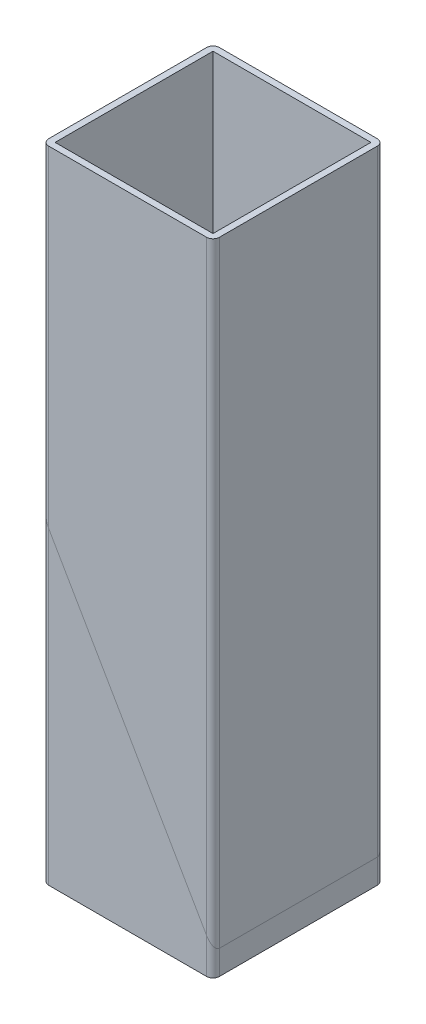
ISO-10303-21;
HEADER;
FILE_DESCRIPTION(('STEP AP214'),'2;1');
FILE_NAME('part.step','',(''),(''),'','','');
FILE_SCHEMA(('AUTOMOTIVE_DESIGN { 1 0 10303 214 1 1 1 1 }'));
ENDSEC;
DATA;
#1=APPLICATION_CONTEXT('core data for automotive mechanical design processes');
#2=APPLICATION_PROTOCOL_DEFINITION('international standard','automotive_design',2000,#1);
#3=PRODUCT_CONTEXT('',#1,'mechanical');
#4=PRODUCT('Part','Part','',(#3));
#5=PRODUCT_RELATED_PRODUCT_CATEGORY('part','',(#4));
#6=PRODUCT_DEFINITION_FORMATION('','',#4);
#7=PRODUCT_DEFINITION_CONTEXT('part definition',#1,'design');
#8=PRODUCT_DEFINITION('design','',#6,#7);
#9=PRODUCT_DEFINITION_SHAPE('','',#8);
#10=(LENGTH_UNIT() NAMED_UNIT(*) SI_UNIT(.MILLI.,.METRE.));
#11=(NAMED_UNIT(*) PLANE_ANGLE_UNIT() SI_UNIT($,.RADIAN.));
#12=(NAMED_UNIT(*) SI_UNIT($,.STERADIAN.) SOLID_ANGLE_UNIT());
#13=UNCERTAINTY_MEASURE_WITH_UNIT(LENGTH_MEASURE(1.E-05),#10,'distance_accuracy_value','');
#14=(GEOMETRIC_REPRESENTATION_CONTEXT(3) GLOBAL_UNCERTAINTY_ASSIGNED_CONTEXT((#13)) GLOBAL_UNIT_ASSIGNED_CONTEXT((#10,
#11,#12)) REPRESENTATION_CONTEXT('',''));
#15=CARTESIAN_POINT('',(0.,0.,0.));
#16=DIRECTION('',(0.,0.,1.));
#17=DIRECTION('',(1.,0.,0.));
#18=AXIS2_PLACEMENT_3D('',#15,#16,#17);
#19=CARTESIAN_POINT('',(-40.,150.,-40.01));
#20=DIRECTION('',(-0.866025403784442,-0.499999999999995,0.));
#21=DIRECTION('',(0.499999999999995,-0.866025403784442,0.));
#22=AXIS2_PLACEMENT_3D('',#19,#20,#21);
#23=PLANE('',#22);
#24=CARTESIAN_POINT('',(-37.,144.803847577293,37.));
#25=DIRECTION('',(-0.866025403784442,-0.499999999999995,0.));
#26=DIRECTION('',(0.499999999999995,-0.866025403784442,0.));
#27=AXIS2_PLACEMENT_3D('',#24,#25,#26);
#28=ELLIPSE('',#27,6.00000000000006,3.);
#29=CARTESIAN_POINT('',(-40.,150.,37.));
#30=VERTEX_POINT('',#29);
#31=CARTESIAN_POINT('',(-37.,144.803847577293,40.));
#32=VERTEX_POINT('',#31);
#33=EDGE_CURVE('E181',#30,#32,#28,.F.);
#34=ORIENTED_EDGE('',*,*,#33,.F.);
#35=DIRECTION('',(0.,0.,-1.));
#36=VECTOR('',#35,1.);
#37=CARTESIAN_POINT('',(-40.,150.,-40.0000000000001));
#38=LINE('',#37,#36);
#39=CARTESIAN_POINT('',(-40.,150.,-37.));
#40=VERTEX_POINT('',#39);
#41=EDGE_CURVE('E190',#30,#40,#38,.T.);
#42=ORIENTED_EDGE('',*,*,#41,.T.);
#43=CARTESIAN_POINT('',(-37.,144.803847577293,-37.));
#44=DIRECTION('',(-0.866025403784442,-0.499999999999995,0.));
#45=DIRECTION('',(0.499999999999995,-0.866025403784442,0.));
#46=AXIS2_PLACEMENT_3D('',#43,#44,#45);
#47=ELLIPSE('',#46,6.00000000000006,3.);
#48=CARTESIAN_POINT('',(-37.,144.803847577293,-40.));
#49=VERTEX_POINT('',#48);
#50=EDGE_CURVE('E179',#49,#40,#47,.F.);
#51=ORIENTED_EDGE('',*,*,#50,.F.);
#52=DIRECTION('',(0.499999999999995,-0.866025403784442,0.));
#53=VECTOR('',#52,1.);
#54=CARTESIAN_POINT('',(-104.951905283832,262.500000000001,-40.));
#55=LINE('',#54,#53);
#56=CARTESIAN_POINT('',(37.,16.6320878171947,-40.));
#57=VERTEX_POINT('',#56);
#58=EDGE_CURVE('E187',#49,#57,#55,.T.);
#59=ORIENTED_EDGE('',*,*,#58,.T.);
#60=CARTESIAN_POINT('',(37.,16.6320878171947,-37.));
#61=DIRECTION('',(-0.866025403784442,-0.499999999999995,0.));
#62=DIRECTION('',(0.499999999999995,-0.866025403784442,0.));
#63=AXIS2_PLACEMENT_3D('',#60,#61,#62);
#64=ELLIPSE('',#63,6.00000000000006,3.);
#65=CARTESIAN_POINT('',(40.,11.435935394488,-37.));
#66=VERTEX_POINT('',#65);
#67=EDGE_CURVE('E174',#66,#57,#64,.F.);
#68=ORIENTED_EDGE('',*,*,#67,.F.);
#69=DIRECTION('',(0.,0.,1.));
#70=VECTOR('',#69,1.);
#71=CARTESIAN_POINT('',(40.,11.435935394488,-40.0000000000001));
#72=LINE('',#71,#70);
#73=CARTESIAN_POINT('',(40.,11.435935394488,37.));
#74=VERTEX_POINT('',#73);
#75=EDGE_CURVE('E149',#66,#74,#72,.T.);
#76=ORIENTED_EDGE('',*,*,#75,.T.);
#77=CARTESIAN_POINT('',(37.,16.6320878171947,37.));
#78=DIRECTION('',(-0.866025403784442,-0.499999999999995,0.));
#79=DIRECTION('',(0.499999999999995,-0.866025403784442,0.));
#80=AXIS2_PLACEMENT_3D('',#77,#78,#79);
#81=ELLIPSE('',#80,6.00000000000006,3.);
#82=CARTESIAN_POINT('',(37.,16.6320878171947,40.));
#83=VERTEX_POINT('',#82);
#84=EDGE_CURVE('E177',#83,#74,#81,.F.);
#85=ORIENTED_EDGE('',*,*,#84,.F.);
#86=DIRECTION('',(-0.499999999999995,0.866025403784442,0.));
#87=VECTOR('',#86,1.);
#88=CARTESIAN_POINT('',(-104.951905283832,262.500000000001,40.));
#89=LINE('',#88,#87);
#90=EDGE_CURVE('E193',#83,#32,#89,.T.);
#91=ORIENTED_EDGE('',*,*,#90,.T.);
#92=EDGE_LOOP('',(#34,#42,#51,#59,#68,#76,#85,#91));
#93=FACE_BOUND('',#92,.T.);
#94=DIRECTION('',(0.,0.,1.));
#95=VECTOR('',#94,1.);
#96=CARTESIAN_POINT('',(37.,16.6320878171947,-37.0000000000002));
#97=LINE('',#96,#95);
#98=CARTESIAN_POINT('',(37.,16.6320878171946,-37.));
#99=VERTEX_POINT('',#98);
#100=CARTESIAN_POINT('',(37.,16.6320878171946,37.));
#101=VERTEX_POINT('',#100);
#102=EDGE_CURVE('E144',#99,#101,#97,.T.);
#103=ORIENTED_EDGE('',*,*,#102,.F.);
#104=DIRECTION('',(0.499999999999995,-0.866025403784442,0.));
#105=VECTOR('',#104,1.);
#106=CARTESIAN_POINT('',(-104.201905283832,261.200961894324,-37.));
#107=LINE('',#106,#105);
#108=CARTESIAN_POINT('',(-37.,144.803847577293,-37.));
#109=VERTEX_POINT('',#108);
#110=EDGE_CURVE('E136',#109,#99,#107,.T.);
#111=ORIENTED_EDGE('',*,*,#110,.F.);
#112=DIRECTION('',(0.,0.,-1.));
#113=VECTOR('',#112,1.);
#114=CARTESIAN_POINT('',(-37.,144.803847577293,-37.0000000000001));
#115=LINE('',#114,#113);
#116=CARTESIAN_POINT('',(-37.,144.803847577293,37.));
#117=VERTEX_POINT('',#116);
#118=EDGE_CURVE('E143',#117,#109,#115,.T.);
#119=ORIENTED_EDGE('',*,*,#118,.F.);
#120=DIRECTION('',(-0.499999999999995,0.866025403784442,0.));
#121=VECTOR('',#120,1.);
#122=CARTESIAN_POINT('',(-104.201905283832,261.200961894324,37.));
#123=LINE('',#122,#121);
#124=EDGE_CURVE('E147',#101,#117,#123,.T.);
#125=ORIENTED_EDGE('',*,*,#124,.F.);
#126=EDGE_LOOP('',(#103,#111,#119,#125));
#127=FACE_BOUND('',#126,.T.);
#128=ADVANCED_FACE('F47',(#93,#127),#23,.T.);
#129=CARTESIAN_POINT('',(-37.,300.,-37.));
#130=DIRECTION('',(0.,0.,1.));
#131=DIRECTION('',(1.,0.,0.));
#132=AXIS2_PLACEMENT_3D('',#129,#130,#131);
#133=PLANE('',#132);
#134=DIRECTION('',(0.,-1.,0.));
#135=VECTOR('',#134,1.);
#136=CARTESIAN_POINT('',(-37.,300.,-37.));
#137=LINE('',#136,#135);
#138=CARTESIAN_POINT('',(-37.,300.,-37.));
#139=VERTEX_POINT('',#138);
#140=EDGE_CURVE('E140',#139,#109,#137,.T.);
#141=ORIENTED_EDGE('',*,*,#140,.T.);
#142=ORIENTED_EDGE('',*,*,#110,.T.);
#143=DIRECTION('',(0.,-1.,0.));
#144=VECTOR('',#143,1.);
#145=CARTESIAN_POINT('',(37.,300.,-37.));
#146=LINE('',#145,#144);
#147=CARTESIAN_POINT('',(37.,300.,-37.));
#148=VERTEX_POINT('',#147);
#149=EDGE_CURVE('E139',#148,#99,#146,.T.);
#150=ORIENTED_EDGE('',*,*,#149,.F.);
#151=DIRECTION('',(-1.,0.,0.));
#152=VECTOR('',#151,1.);
#153=CARTESIAN_POINT('',(-37.,300.,-37.));
#154=LINE('',#153,#152);
#155=EDGE_CURVE('E56',#148,#139,#154,.T.);
#156=ORIENTED_EDGE('',*,*,#155,.T.);
#157=EDGE_LOOP('',(#141,#142,#150,#156));
#158=FACE_BOUND('',#157,.T.);
#159=ADVANCED_FACE('F138',(#158),#133,.T.);
#160=CARTESIAN_POINT('',(-40.,300.,-40.));
#161=DIRECTION('',(1.,0.,0.));
#162=DIRECTION('',(0.,0.,-1.));
#163=AXIS2_PLACEMENT_3D('',#160,#161,#162);
#164=PLANE('',#163);
#165=ORIENTED_EDGE('',*,*,#41,.F.);
#166=DIRECTION('',(0.,-1.,0.));
#167=VECTOR('',#166,1.);
#168=CARTESIAN_POINT('',(-40.,300.,37.));
#169=LINE('',#168,#167);
#170=CARTESIAN_POINT('',(-40.,300.,37.));
#171=VERTEX_POINT('',#170);
#172=EDGE_CURVE('E206',#30,#171,#169,.F.);
#173=ORIENTED_EDGE('',*,*,#172,.T.);
#174=DIRECTION('',(0.,0.,1.));
#175=VECTOR('',#174,1.);
#176=CARTESIAN_POINT('',(-40.,300.,-40.));
#177=LINE('',#176,#175);
#178=CARTESIAN_POINT('',(-40.,300.,-37.));
#179=VERTEX_POINT('',#178);
#180=EDGE_CURVE('E220',#179,#171,#177,.T.);
#181=ORIENTED_EDGE('',*,*,#180,.F.);
#182=DIRECTION('',(0.,-1.,0.));
#183=VECTOR('',#182,1.);
#184=CARTESIAN_POINT('',(-40.,300.,-37.));
#185=LINE('',#184,#183);
#186=EDGE_CURVE('E208',#179,#40,#185,.T.);
#187=ORIENTED_EDGE('',*,*,#186,.T.);
#188=EDGE_LOOP('',(#165,#173,#181,#187));
#189=FACE_BOUND('',#188,.T.);
#190=ADVANCED_FACE('F264',(#189),#164,.F.);
#191=CARTESIAN_POINT('',(0.,300.,0.));
#192=DIRECTION('',(0.,1.,0.));
#193=DIRECTION('',(0.,0.,1.));
#194=AXIS2_PLACEMENT_3D('',#191,#192,#193);
#195=PLANE('',#194);
#196=ORIENTED_EDGE('',*,*,#180,.T.);
#197=CARTESIAN_POINT('',(-37.,300.,37.));
#198=DIRECTION('',(0.,1.,0.));
#199=DIRECTION('',(0.,0.,1.));
#200=AXIS2_PLACEMENT_3D('',#197,#198,#199);
#201=CIRCLE('',#200,3.);
#202=CARTESIAN_POINT('',(-37.,300.,40.));
#203=VERTEX_POINT('',#202);
#204=EDGE_CURVE('E205',#171,#203,#201,.T.);
#205=ORIENTED_EDGE('',*,*,#204,.T.);
#206=DIRECTION('',(1.,0.,0.));
#207=VECTOR('',#206,1.);
#208=CARTESIAN_POINT('',(-40.,300.,40.));
#209=LINE('',#208,#207);
#210=CARTESIAN_POINT('',(37.,300.,40.));
#211=VERTEX_POINT('',#210);
#212=EDGE_CURVE('E217',#203,#211,#209,.T.);
#213=ORIENTED_EDGE('',*,*,#212,.T.);
#214=CARTESIAN_POINT('',(37.,300.,37.));
#215=DIRECTION('',(0.,1.,0.));
#216=DIRECTION('',(0.,0.,1.));
#217=AXIS2_PLACEMENT_3D('',#214,#215,#216);
#218=CIRCLE('',#217,3.);
#219=CARTESIAN_POINT('',(40.,300.,37.));
#220=VERTEX_POINT('',#219);
#221=EDGE_CURVE('E242',#211,#220,#218,.T.);
#222=ORIENTED_EDGE('',*,*,#221,.T.);
#223=DIRECTION('',(0.,0.,-1.));
#224=VECTOR('',#223,1.);
#225=CARTESIAN_POINT('',(40.,300.,-40.));
#226=LINE('',#225,#224);
#227=CARTESIAN_POINT('',(40.,300.,-37.));
#228=VERTEX_POINT('',#227);
#229=EDGE_CURVE('E152',#220,#228,#226,.T.);
#230=ORIENTED_EDGE('',*,*,#229,.T.);
#231=CARTESIAN_POINT('',(37.,300.,-37.));
#232=DIRECTION('',(0.,1.,0.));
#233=DIRECTION('',(0.,0.,1.));
#234=AXIS2_PLACEMENT_3D('',#231,#232,#233);
#235=CIRCLE('',#234,3.);
#236=CARTESIAN_POINT('',(37.,300.,-40.));
#237=VERTEX_POINT('',#236);
#238=EDGE_CURVE('E209',#228,#237,#235,.T.);
#239=ORIENTED_EDGE('',*,*,#238,.T.);
#240=DIRECTION('',(-1.,0.,0.));
#241=VECTOR('',#240,1.);
#242=CARTESIAN_POINT('',(-40.,300.,-40.));
#243=LINE('',#242,#241);
#244=CARTESIAN_POINT('',(-37.,300.,-40.));
#245=VERTEX_POINT('',#244);
#246=EDGE_CURVE('E157',#237,#245,#243,.T.);
#247=ORIENTED_EDGE('',*,*,#246,.T.);
#248=CARTESIAN_POINT('',(-37.,300.,-37.));
#249=DIRECTION('',(0.,1.,0.));
#250=DIRECTION('',(0.,0.,1.));
#251=AXIS2_PLACEMENT_3D('',#248,#249,#250);
#252=CIRCLE('',#251,3.);
#253=EDGE_CURVE('E233',#245,#179,#252,.T.);
#254=ORIENTED_EDGE('',*,*,#253,.T.);
#255=EDGE_LOOP('',(#196,#205,#213,#222,#230,#239,#247,#254));
#256=FACE_BOUND('',#255,.T.);
#257=ORIENTED_EDGE('',*,*,#155,.F.);
#258=DIRECTION('',(0.,0.,-1.));
#259=VECTOR('',#258,1.);
#260=CARTESIAN_POINT('',(37.,300.,-37.));
#261=LINE('',#260,#259);
#262=CARTESIAN_POINT('',(37.,300.,37.));
#263=VERTEX_POINT('',#262);
#264=EDGE_CURVE('E12',#263,#148,#261,.T.);
#265=ORIENTED_EDGE('',*,*,#264,.F.);
#266=DIRECTION('',(1.,0.,0.));
#267=VECTOR('',#266,1.);
#268=CARTESIAN_POINT('',(-37.,300.,37.));
#269=LINE('',#268,#267);
#270=CARTESIAN_POINT('',(-37.,300.,37.));
#271=VERTEX_POINT('',#270);
#272=EDGE_CURVE('E165',#271,#263,#269,.T.);
#273=ORIENTED_EDGE('',*,*,#272,.F.);
#274=DIRECTION('',(0.,0.,1.));
#275=VECTOR('',#274,1.);
#276=CARTESIAN_POINT('',(-37.,300.,-37.));
#277=LINE('',#276,#275);
#278=EDGE_CURVE('E167',#139,#271,#277,.T.);
#279=ORIENTED_EDGE('',*,*,#278,.F.);
#280=EDGE_LOOP('',(#257,#265,#273,#279));
#281=FACE_BOUND('',#280,.T.);
#282=ADVANCED_FACE('F231',(#256,#281),#195,.T.);
#283=CARTESIAN_POINT('',(-40.,300.,-40.));
#284=DIRECTION('',(0.,0.,1.));
#285=DIRECTION('',(1.,0.,0.));
#286=AXIS2_PLACEMENT_3D('',#283,#284,#285);
#287=PLANE('',#286);
#288=ORIENTED_EDGE('',*,*,#58,.F.);
#289=DIRECTION('',(0.,-1.,0.));
#290=VECTOR('',#289,1.);
#291=CARTESIAN_POINT('',(-37.,300.,-40.));
#292=LINE('',#291,#290);
#293=EDGE_CURVE('E200',#49,#245,#292,.F.);
#294=ORIENTED_EDGE('',*,*,#293,.T.);
#295=ORIENTED_EDGE('',*,*,#246,.F.);
#296=DIRECTION('',(0.,-1.,0.));
#297=VECTOR('',#296,1.);
#298=CARTESIAN_POINT('',(37.,300.,-40.));
#299=LINE('',#298,#297);
#300=EDGE_CURVE('E202',#237,#57,#299,.T.);
#301=ORIENTED_EDGE('',*,*,#300,.T.);
#302=EDGE_LOOP('',(#288,#294,#295,#301));
#303=FACE_BOUND('',#302,.T.);
#304=ADVANCED_FACE('F262',(#303),#287,.F.);
#305=CARTESIAN_POINT('',(40.,300.,-40.));
#306=DIRECTION('',(-1.,0.,0.));
#307=DIRECTION('',(0.,0.,1.));
#308=AXIS2_PLACEMENT_3D('',#305,#306,#307);
#309=PLANE('',#308);
#310=ORIENTED_EDGE('',*,*,#75,.F.);
#311=DIRECTION('',(0.,-1.,0.));
#312=VECTOR('',#311,1.);
#313=CARTESIAN_POINT('',(40.,300.,-37.));
#314=LINE('',#313,#312);
#315=EDGE_CURVE('E198',#66,#228,#314,.F.);
#316=ORIENTED_EDGE('',*,*,#315,.T.);
#317=ORIENTED_EDGE('',*,*,#229,.F.);
#318=DIRECTION('',(0.,-1.,0.));
#319=VECTOR('',#318,1.);
#320=CARTESIAN_POINT('',(40.,300.,37.));
#321=LINE('',#320,#319);
#322=EDGE_CURVE('E176',#220,#74,#321,.T.);
#323=ORIENTED_EDGE('',*,*,#322,.T.);
#324=EDGE_LOOP('',(#310,#316,#317,#323));
#325=FACE_BOUND('',#324,.T.);
#326=ADVANCED_FACE('F258',(#325),#309,.F.);
#327=CARTESIAN_POINT('',(37.,300.,-37.));
#328=DIRECTION('',(0.,-1.,0.));
#329=DIRECTION('',(0.,0.,-1.));
#330=AXIS2_PLACEMENT_3D('',#327,#328,#329);
#331=CYLINDRICAL_SURFACE('',#330,3.);
#332=ORIENTED_EDGE('',*,*,#315,.F.);
#333=ORIENTED_EDGE('',*,*,#67,.T.);
#334=ORIENTED_EDGE('',*,*,#300,.F.);
#335=ORIENTED_EDGE('',*,*,#238,.F.);
#336=EDGE_LOOP('',(#332,#333,#334,#335));
#337=FACE_BOUND('',#336,.T.);
#338=ADVANCED_FACE('F49',(#337),#331,.T.);
#339=CARTESIAN_POINT('',(-40.,300.,40.));
#340=DIRECTION('',(0.,0.,-1.));
#341=DIRECTION('',(-1.,0.,0.));
#342=AXIS2_PLACEMENT_3D('',#339,#340,#341);
#343=PLANE('',#342);
#344=ORIENTED_EDGE('',*,*,#90,.F.);
#345=DIRECTION('',(0.,-1.,0.));
#346=VECTOR('',#345,1.);
#347=CARTESIAN_POINT('',(37.,300.,40.));
#348=LINE('',#347,#346);
#349=EDGE_CURVE('E160',#83,#211,#348,.F.);
#350=ORIENTED_EDGE('',*,*,#349,.T.);
#351=ORIENTED_EDGE('',*,*,#212,.F.);
#352=DIRECTION('',(0.,-1.,0.));
#353=VECTOR('',#352,1.);
#354=CARTESIAN_POINT('',(-37.,300.,40.));
#355=LINE('',#354,#353);
#356=EDGE_CURVE('E211',#203,#32,#355,.T.);
#357=ORIENTED_EDGE('',*,*,#356,.T.);
#358=EDGE_LOOP('',(#344,#350,#351,#357));
#359=FACE_BOUND('',#358,.T.);
#360=ADVANCED_FACE('F248',(#359),#343,.F.);
#361=CARTESIAN_POINT('',(37.,300.,37.));
#362=DIRECTION('',(0.,-1.,0.));
#363=DIRECTION('',(0.,0.,-1.));
#364=AXIS2_PLACEMENT_3D('',#361,#362,#363);
#365=CYLINDRICAL_SURFACE('',#364,3.);
#366=ORIENTED_EDGE('',*,*,#349,.F.);
#367=ORIENTED_EDGE('',*,*,#84,.T.);
#368=ORIENTED_EDGE('',*,*,#322,.F.);
#369=ORIENTED_EDGE('',*,*,#221,.F.);
#370=EDGE_LOOP('',(#366,#367,#368,#369));
#371=FACE_BOUND('',#370,.T.);
#372=ADVANCED_FACE('F253',(#371),#365,.T.);
#373=CARTESIAN_POINT('',(-37.,300.,-37.));
#374=DIRECTION('',(0.,-1.,0.));
#375=DIRECTION('',(0.,0.,-1.));
#376=AXIS2_PLACEMENT_3D('',#373,#374,#375);
#377=CYLINDRICAL_SURFACE('',#376,3.);
#378=ORIENTED_EDGE('',*,*,#293,.F.);
#379=ORIENTED_EDGE('',*,*,#50,.T.);
#380=ORIENTED_EDGE('',*,*,#186,.F.);
#381=ORIENTED_EDGE('',*,*,#253,.F.);
#382=EDGE_LOOP('',(#378,#379,#380,#381));
#383=FACE_BOUND('',#382,.T.);
#384=ADVANCED_FACE('F241',(#383),#377,.T.);
#385=CARTESIAN_POINT('',(-37.,300.,37.));
#386=DIRECTION('',(0.,-1.,0.));
#387=DIRECTION('',(0.,0.,-1.));
#388=AXIS2_PLACEMENT_3D('',#385,#386,#387);
#389=CYLINDRICAL_SURFACE('',#388,3.);
#390=ORIENTED_EDGE('',*,*,#172,.F.);
#391=ORIENTED_EDGE('',*,*,#33,.T.);
#392=ORIENTED_EDGE('',*,*,#356,.F.);
#393=ORIENTED_EDGE('',*,*,#204,.F.);
#394=EDGE_LOOP('',(#390,#391,#392,#393));
#395=FACE_BOUND('',#394,.T.);
#396=ADVANCED_FACE('F249',(#395),#389,.T.);
#397=CARTESIAN_POINT('',(-37.,300.,-37.));
#398=DIRECTION('',(1.,0.,0.));
#399=DIRECTION('',(0.,0.,-1.));
#400=AXIS2_PLACEMENT_3D('',#397,#398,#399);
#401=PLANE('',#400);
#402=DIRECTION('',(0.,-1.,0.));
#403=VECTOR('',#402,1.);
#404=CARTESIAN_POINT('',(-37.,300.,37.));
#405=LINE('',#404,#403);
#406=EDGE_CURVE('E154',#271,#117,#405,.T.);
#407=ORIENTED_EDGE('',*,*,#406,.T.);
#408=ORIENTED_EDGE('',*,*,#118,.T.);
#409=ORIENTED_EDGE('',*,*,#140,.F.);
#410=ORIENTED_EDGE('',*,*,#278,.T.);
#411=EDGE_LOOP('',(#407,#408,#409,#410));
#412=FACE_BOUND('',#411,.T.);
#413=ADVANCED_FACE('F280',(#412),#401,.T.);
#414=CARTESIAN_POINT('',(37.,300.,-37.));
#415=DIRECTION('',(-1.,0.,0.));
#416=DIRECTION('',(0.,0.,1.));
#417=AXIS2_PLACEMENT_3D('',#414,#415,#416);
#418=PLANE('',#417);
#419=ORIENTED_EDGE('',*,*,#149,.T.);
#420=ORIENTED_EDGE('',*,*,#102,.T.);
#421=DIRECTION('',(0.,-1.,0.));
#422=VECTOR('',#421,1.);
#423=CARTESIAN_POINT('',(37.,300.,37.));
#424=LINE('',#423,#422);
#425=EDGE_CURVE('E51',#263,#101,#424,.T.);
#426=ORIENTED_EDGE('',*,*,#425,.F.);
#427=ORIENTED_EDGE('',*,*,#264,.T.);
#428=EDGE_LOOP('',(#419,#420,#426,#427));
#429=FACE_BOUND('',#428,.T.);
#430=ADVANCED_FACE('F151',(#429),#418,.T.);
#431=CARTESIAN_POINT('',(-37.,300.,37.));
#432=DIRECTION('',(0.,0.,-1.));
#433=DIRECTION('',(-1.,0.,0.));
#434=AXIS2_PLACEMENT_3D('',#431,#432,#433);
#435=PLANE('',#434);
#436=ORIENTED_EDGE('',*,*,#425,.T.);
#437=ORIENTED_EDGE('',*,*,#124,.T.);
#438=ORIENTED_EDGE('',*,*,#406,.F.);
#439=ORIENTED_EDGE('',*,*,#272,.T.);
#440=EDGE_LOOP('',(#436,#437,#438,#439));
#441=FACE_BOUND('',#440,.T.);
#442=ADVANCED_FACE('F279',(#441),#435,.T.);
#443=CLOSED_SHELL('',(#128,#159,#190,#282,#304,#326,#338,#360,#372,#384,#396,#413,#430,#442));
#444=MANIFOLD_SOLID_BREP('B2',#443);
#445=CARTESIAN_POINT('',(-40.,150.,-40.01));
#446=DIRECTION('',(-0.866025403784442,-0.499999999999995,0.));
#447=DIRECTION('',(0.499999999999995,-0.866025403784442,0.));
#448=AXIS2_PLACEMENT_3D('',#445,#446,#447);
#449=PLANE('',#448);
#450=DIRECTION('',(0.,0.,1.));
#451=VECTOR('',#450,1.);
#452=CARTESIAN_POINT('',(37.,16.6320878171947,-37.0000000000002));
#453=LINE('',#452,#451);
#454=CARTESIAN_POINT('',(37.,16.6320878171946,-37.));
#455=VERTEX_POINT('',#454);
#456=CARTESIAN_POINT('',(37.,16.6320878171946,37.));
#457=VERTEX_POINT('',#456);
#458=EDGE_CURVE('E384',#455,#457,#453,.T.);
#459=ORIENTED_EDGE('',*,*,#458,.T.);
#460=DIRECTION('',(-0.499999999999995,0.866025403784442,0.));
#461=VECTOR('',#460,1.);
#462=CARTESIAN_POINT('',(-104.201905283832,261.200961894324,37.));
#463=LINE('',#462,#461);
#464=CARTESIAN_POINT('',(-37.,144.803847577293,37.));
#465=VERTEX_POINT('',#464);
#466=EDGE_CURVE('E558',#457,#465,#463,.T.);
#467=ORIENTED_EDGE('',*,*,#466,.T.);
#468=DIRECTION('',(0.,0.,-1.));
#469=VECTOR('',#468,1.);
#470=CARTESIAN_POINT('',(-37.,144.803847577293,-37.0000000000001));
#471=LINE('',#470,#469);
#472=CARTESIAN_POINT('',(-37.,144.803847577293,-37.));
#473=VERTEX_POINT('',#472);
#474=EDGE_CURVE('E561',#465,#473,#471,.T.);
#475=ORIENTED_EDGE('',*,*,#474,.T.);
#476=DIRECTION('',(0.499999999999995,-0.866025403784442,0.));
#477=VECTOR('',#476,1.);
#478=CARTESIAN_POINT('',(-104.201905283832,261.200961894324,-37.));
#479=LINE('',#478,#477);
#480=EDGE_CURVE('E563',#473,#455,#479,.T.);
#481=ORIENTED_EDGE('',*,*,#480,.T.);
#482=EDGE_LOOP('',(#459,#467,#475,#481));
#483=FACE_BOUND('',#482,.T.);
#484=CARTESIAN_POINT('',(-37.,144.803847577293,37.));
#485=DIRECTION('',(-0.866025403784442,-0.499999999999995,0.));
#486=DIRECTION('',(0.499999999999995,-0.866025403784442,0.));
#487=AXIS2_PLACEMENT_3D('',#484,#485,#486);
#488=ELLIPSE('',#487,6.00000000000006,3.);
#489=CARTESIAN_POINT('',(-40.,150.,37.));
#490=VERTEX_POINT('',#489);
#491=CARTESIAN_POINT('',(-37.,144.803847577293,40.));
#492=VERTEX_POINT('',#491);
#493=EDGE_CURVE('E555',#490,#492,#488,.F.);
#494=ORIENTED_EDGE('',*,*,#493,.T.);
#495=DIRECTION('',(-0.499999999999995,0.866025403784442,0.));
#496=VECTOR('',#495,1.);
#497=CARTESIAN_POINT('',(-104.951905283832,262.500000000001,40.));
#498=LINE('',#497,#496);
#499=CARTESIAN_POINT('',(37.,16.6320878171947,40.));
#500=VERTEX_POINT('',#499);
#501=EDGE_CURVE('E542',#500,#492,#498,.T.);
#502=ORIENTED_EDGE('',*,*,#501,.F.);
#503=CARTESIAN_POINT('',(37.,16.6320878171947,37.));
#504=DIRECTION('',(-0.866025403784442,-0.499999999999995,0.));
#505=DIRECTION('',(0.499999999999995,-0.866025403784442,0.));
#506=AXIS2_PLACEMENT_3D('',#503,#504,#505);
#507=ELLIPSE('',#506,6.00000000000006,3.);
#508=CARTESIAN_POINT('',(40.,11.435935394488,37.));
#509=VERTEX_POINT('',#508);
#510=EDGE_CURVE('E389',#500,#509,#507,.F.);
#511=ORIENTED_EDGE('',*,*,#510,.T.);
#512=DIRECTION('',(0.,0.,1.));
#513=VECTOR('',#512,1.);
#514=CARTESIAN_POINT('',(40.,11.435935394488,-40.0000000000001));
#515=LINE('',#514,#513);
#516=CARTESIAN_POINT('',(40.,11.435935394488,-37.));
#517=VERTEX_POINT('',#516);
#518=EDGE_CURVE('E548',#517,#509,#515,.T.);
#519=ORIENTED_EDGE('',*,*,#518,.F.);
#520=CARTESIAN_POINT('',(37.,16.6320878171947,-37.));
#521=DIRECTION('',(-0.866025403784442,-0.499999999999995,0.));
#522=DIRECTION('',(0.499999999999995,-0.866025403784442,0.));
#523=AXIS2_PLACEMENT_3D('',#520,#521,#522);
#524=ELLIPSE('',#523,6.00000000000006,3.);
#525=CARTESIAN_POINT('',(37.,16.6320878171947,-40.));
#526=VERTEX_POINT('',#525);
#527=EDGE_CURVE('E45',#517,#526,#524,.F.);
#528=ORIENTED_EDGE('',*,*,#527,.T.);
#529=DIRECTION('',(0.499999999999995,-0.866025403784442,0.));
#530=VECTOR('',#529,1.);
#531=CARTESIAN_POINT('',(-104.951905283832,262.500000000001,-40.));
#532=LINE('',#531,#530);
#533=CARTESIAN_POINT('',(-37.,144.803847577293,-40.));
#534=VERTEX_POINT('',#533);
#535=EDGE_CURVE('E403',#534,#526,#532,.T.);
#536=ORIENTED_EDGE('',*,*,#535,.F.);
#537=CARTESIAN_POINT('',(-37.,144.803847577293,-37.));
#538=DIRECTION('',(-0.866025403784442,-0.499999999999995,0.));
#539=DIRECTION('',(0.499999999999995,-0.866025403784442,0.));
#540=AXIS2_PLACEMENT_3D('',#537,#538,#539);
#541=ELLIPSE('',#540,6.00000000000006,3.);
#542=CARTESIAN_POINT('',(-40.,150.,-37.));
#543=VERTEX_POINT('',#542);
#544=EDGE_CURVE('E552',#534,#543,#541,.F.);
#545=ORIENTED_EDGE('',*,*,#544,.T.);
#546=DIRECTION('',(0.,0.,-1.));
#547=VECTOR('',#546,1.);
#548=CARTESIAN_POINT('',(-40.,150.,-40.0000000000001));
#549=LINE('',#548,#547);
#550=EDGE_CURVE('E545',#490,#543,#549,.T.);
#551=ORIENTED_EDGE('',*,*,#550,.F.);
#552=EDGE_LOOP('',(#494,#502,#511,#519,#528,#536,#545,#551));
#553=FACE_BOUND('',#552,.T.);
#554=ADVANCED_FACE('F381',(#483,#553),#449,.F.);
#555=CARTESIAN_POINT('',(0.,0.,0.));
#556=DIRECTION('',(0.,1.,0.));
#557=DIRECTION('',(0.,0.,1.));
#558=AXIS2_PLACEMENT_3D('',#555,#556,#557);
#559=PLANE('',#558);
#560=DIRECTION('',(1.,0.,0.));
#561=VECTOR('',#560,1.);
#562=CARTESIAN_POINT('',(-40.,0.,40.));
#563=LINE('',#562,#561);
#564=CARTESIAN_POINT('',(-37.,0.,40.));
#565=VERTEX_POINT('',#564);
#566=CARTESIAN_POINT('',(37.,0.,40.));
#567=VERTEX_POINT('',#566);
#568=EDGE_CURVE('E513',#565,#567,#563,.T.);
#569=ORIENTED_EDGE('',*,*,#568,.F.);
#570=CARTESIAN_POINT('',(-37.,0.,37.));
#571=DIRECTION('',(0.,1.,0.));
#572=DIRECTION('',(0.,0.,1.));
#573=AXIS2_PLACEMENT_3D('',#570,#571,#572);
#574=CIRCLE('',#573,3.);
#575=CARTESIAN_POINT('',(-40.,0.,37.));
#576=VERTEX_POINT('',#575);
#577=EDGE_CURVE('E527',#565,#576,#574,.F.);
#578=ORIENTED_EDGE('',*,*,#577,.T.);
#579=DIRECTION('',(0.,0.,1.));
#580=VECTOR('',#579,1.);
#581=CARTESIAN_POINT('',(-40.,0.,-40.));
#582=LINE('',#581,#580);
#583=CARTESIAN_POINT('',(-40.,0.,-37.));
#584=VERTEX_POINT('',#583);
#585=EDGE_CURVE('E510',#584,#576,#582,.T.);
#586=ORIENTED_EDGE('',*,*,#585,.F.);
#587=CARTESIAN_POINT('',(-37.,0.,-37.));
#588=DIRECTION('',(0.,1.,0.));
#589=DIRECTION('',(0.,0.,1.));
#590=AXIS2_PLACEMENT_3D('',#587,#588,#589);
#591=CIRCLE('',#590,3.);
#592=CARTESIAN_POINT('',(-37.,0.,-40.));
#593=VERTEX_POINT('',#592);
#594=EDGE_CURVE('E525',#584,#593,#591,.F.);
#595=ORIENTED_EDGE('',*,*,#594,.T.);
#596=DIRECTION('',(-1.,0.,0.));
#597=VECTOR('',#596,1.);
#598=CARTESIAN_POINT('',(-40.,0.,-40.));
#599=LINE('',#598,#597);
#600=CARTESIAN_POINT('',(37.,0.,-40.));
#601=VERTEX_POINT('',#600);
#602=EDGE_CURVE('E507',#601,#593,#599,.T.);
#603=ORIENTED_EDGE('',*,*,#602,.F.);
#604=CARTESIAN_POINT('',(37.,0.,-37.));
#605=DIRECTION('',(0.,1.,0.));
#606=DIRECTION('',(0.,0.,1.));
#607=AXIS2_PLACEMENT_3D('',#604,#605,#606);
#608=CIRCLE('',#607,3.);
#609=CARTESIAN_POINT('',(40.,0.,-37.));
#610=VERTEX_POINT('',#609);
#611=EDGE_CURVE('E521',#601,#610,#608,.F.);
#612=ORIENTED_EDGE('',*,*,#611,.T.);
#613=DIRECTION('',(0.,0.,-1.));
#614=VECTOR('',#613,1.);
#615=CARTESIAN_POINT('',(40.,0.,-40.));
#616=LINE('',#615,#614);
#617=CARTESIAN_POINT('',(40.,0.,37.));
#618=VERTEX_POINT('',#617);
#619=EDGE_CURVE('E481',#618,#610,#616,.T.);
#620=ORIENTED_EDGE('',*,*,#619,.F.);
#621=CARTESIAN_POINT('',(37.,0.,37.));
#622=DIRECTION('',(0.,1.,0.));
#623=DIRECTION('',(0.,0.,1.));
#624=AXIS2_PLACEMENT_3D('',#621,#622,#623);
#625=CIRCLE('',#624,3.);
#626=EDGE_CURVE('E523',#618,#567,#625,.F.);
#627=ORIENTED_EDGE('',*,*,#626,.T.);
#628=EDGE_LOOP('',(#569,#578,#586,#595,#603,#612,#620,#627));
#629=FACE_BOUND('',#628,.T.);
#630=DIRECTION('',(0.,0.,-1.));
#631=VECTOR('',#630,1.);
#632=CARTESIAN_POINT('',(37.,0.,-37.));
#633=LINE('',#632,#631);
#634=CARTESIAN_POINT('',(37.,0.,37.));
#635=VERTEX_POINT('',#634);
#636=CARTESIAN_POINT('',(37.,0.,-37.));
#637=VERTEX_POINT('',#636);
#638=EDGE_CURVE('E477',#635,#637,#633,.T.);
#639=ORIENTED_EDGE('',*,*,#638,.T.);
#640=DIRECTION('',(-1.,0.,0.));
#641=VECTOR('',#640,1.);
#642=CARTESIAN_POINT('',(-37.,0.,-37.));
#643=LINE('',#642,#641);
#644=CARTESIAN_POINT('',(-37.,0.,-37.));
#645=VERTEX_POINT('',#644);
#646=EDGE_CURVE('E485',#637,#645,#643,.T.);
#647=ORIENTED_EDGE('',*,*,#646,.T.);
#648=DIRECTION('',(0.,0.,1.));
#649=VECTOR('',#648,1.);
#650=CARTESIAN_POINT('',(-37.,0.,-37.));
#651=LINE('',#650,#649);
#652=CARTESIAN_POINT('',(-37.,0.,37.));
#653=VERTEX_POINT('',#652);
#654=EDGE_CURVE('E491',#645,#653,#651,.T.);
#655=ORIENTED_EDGE('',*,*,#654,.T.);
#656=DIRECTION('',(1.,0.,0.));
#657=VECTOR('',#656,1.);
#658=CARTESIAN_POINT('',(-37.,0.,37.));
#659=LINE('',#658,#657);
#660=EDGE_CURVE('E495',#653,#635,#659,.T.);
#661=ORIENTED_EDGE('',*,*,#660,.T.);
#662=EDGE_LOOP('',(#639,#647,#655,#661));
#663=FACE_BOUND('',#662,.T.);
#664=ADVANCED_FACE('F493',(#629,#663),#559,.F.);
#665=CARTESIAN_POINT('',(40.,300.,-40.));
#666=DIRECTION('',(-1.,0.,0.));
#667=DIRECTION('',(0.,0.,1.));
#668=AXIS2_PLACEMENT_3D('',#665,#666,#667);
#669=PLANE('',#668);
#670=DIRECTION('',(0.,-1.,0.));
#671=VECTOR('',#670,1.);
#672=CARTESIAN_POINT('',(40.,300.,-37.));
#673=LINE('',#672,#671);
#674=EDGE_CURVE('E538',#610,#517,#673,.F.);
#675=ORIENTED_EDGE('',*,*,#674,.T.);
#676=ORIENTED_EDGE('',*,*,#518,.T.);
#677=DIRECTION('',(0.,-1.,0.));
#678=VECTOR('',#677,1.);
#679=CARTESIAN_POINT('',(40.,300.,37.));
#680=LINE('',#679,#678);
#681=EDGE_CURVE('E541',#509,#618,#680,.T.);
#682=ORIENTED_EDGE('',*,*,#681,.T.);
#683=ORIENTED_EDGE('',*,*,#619,.T.);
#684=EDGE_LOOP('',(#675,#676,#682,#683));
#685=FACE_BOUND('',#684,.T.);
#686=ADVANCED_FACE('F585',(#685),#669,.F.);
#687=CARTESIAN_POINT('',(-40.,300.,-40.));
#688=DIRECTION('',(0.,0.,1.));
#689=DIRECTION('',(1.,0.,0.));
#690=AXIS2_PLACEMENT_3D('',#687,#688,#689);
#691=PLANE('',#690);
#692=DIRECTION('',(0.,-1.,0.));
#693=VECTOR('',#692,1.);
#694=CARTESIAN_POINT('',(-37.,300.,-40.));
#695=LINE('',#694,#693);
#696=EDGE_CURVE('E536',#593,#534,#695,.F.);
#697=ORIENTED_EDGE('',*,*,#696,.T.);
#698=ORIENTED_EDGE('',*,*,#535,.T.);
#699=DIRECTION('',(0.,-1.,0.));
#700=VECTOR('',#699,1.);
#701=CARTESIAN_POINT('',(37.,300.,-40.));
#702=LINE('',#701,#700);
#703=EDGE_CURVE('E534',#526,#601,#702,.T.);
#704=ORIENTED_EDGE('',*,*,#703,.T.);
#705=ORIENTED_EDGE('',*,*,#602,.T.);
#706=EDGE_LOOP('',(#697,#698,#704,#705));
#707=FACE_BOUND('',#706,.T.);
#708=ADVANCED_FACE('F605',(#707),#691,.F.);
#709=CARTESIAN_POINT('',(-40.,300.,-40.));
#710=DIRECTION('',(1.,0.,0.));
#711=DIRECTION('',(0.,0.,-1.));
#712=AXIS2_PLACEMENT_3D('',#709,#710,#711);
#713=PLANE('',#712);
#714=DIRECTION('',(0.,-1.,0.));
#715=VECTOR('',#714,1.);
#716=CARTESIAN_POINT('',(-40.,300.,37.));
#717=LINE('',#716,#715);
#718=EDGE_CURVE('E531',#576,#490,#717,.F.);
#719=ORIENTED_EDGE('',*,*,#718,.T.);
#720=ORIENTED_EDGE('',*,*,#550,.T.);
#721=DIRECTION('',(0.,-1.,0.));
#722=VECTOR('',#721,1.);
#723=CARTESIAN_POINT('',(-40.,300.,-37.));
#724=LINE('',#723,#722);
#725=EDGE_CURVE('E529',#543,#584,#724,.T.);
#726=ORIENTED_EDGE('',*,*,#725,.T.);
#727=ORIENTED_EDGE('',*,*,#585,.T.);
#728=EDGE_LOOP('',(#719,#720,#726,#727));
#729=FACE_BOUND('',#728,.T.);
#730=ADVANCED_FACE('F609',(#729),#713,.F.);
#731=CARTESIAN_POINT('',(-40.,300.,40.));
#732=DIRECTION('',(0.,0.,-1.));
#733=DIRECTION('',(-1.,0.,0.));
#734=AXIS2_PLACEMENT_3D('',#731,#732,#733);
#735=PLANE('',#734);
#736=DIRECTION('',(0.,-1.,0.));
#737=VECTOR('',#736,1.);
#738=CARTESIAN_POINT('',(37.,300.,40.));
#739=LINE('',#738,#737);
#740=EDGE_CURVE('E516',#567,#500,#739,.F.);
#741=ORIENTED_EDGE('',*,*,#740,.T.);
#742=ORIENTED_EDGE('',*,*,#501,.T.);
#743=DIRECTION('',(0.,-1.,0.));
#744=VECTOR('',#743,1.);
#745=CARTESIAN_POINT('',(-37.,300.,40.));
#746=LINE('',#745,#744);
#747=EDGE_CURVE('E519',#492,#565,#746,.T.);
#748=ORIENTED_EDGE('',*,*,#747,.T.);
#749=ORIENTED_EDGE('',*,*,#568,.T.);
#750=EDGE_LOOP('',(#741,#742,#748,#749));
#751=FACE_BOUND('',#750,.T.);
#752=ADVANCED_FACE('F612',(#751),#735,.F.);
#753=CARTESIAN_POINT('',(37.,300.,-37.));
#754=DIRECTION('',(-1.,0.,0.));
#755=DIRECTION('',(0.,0.,1.));
#756=AXIS2_PLACEMENT_3D('',#753,#754,#755);
#757=PLANE('',#756);
#758=ORIENTED_EDGE('',*,*,#458,.F.);
#759=DIRECTION('',(0.,-1.,0.));
#760=VECTOR('',#759,1.);
#761=CARTESIAN_POINT('',(37.,300.,-37.));
#762=LINE('',#761,#760);
#763=EDGE_CURVE('E472',#455,#637,#762,.T.);
#764=ORIENTED_EDGE('',*,*,#763,.T.);
#765=ORIENTED_EDGE('',*,*,#638,.F.);
#766=DIRECTION('',(0.,-1.,0.));
#767=VECTOR('',#766,1.);
#768=CARTESIAN_POINT('',(37.,300.,37.));
#769=LINE('',#768,#767);
#770=EDGE_CURVE('E500',#457,#635,#769,.T.);
#771=ORIENTED_EDGE('',*,*,#770,.F.);
#772=EDGE_LOOP('',(#758,#764,#765,#771));
#773=FACE_BOUND('',#772,.T.);
#774=ADVANCED_FACE('F474',(#773),#757,.T.);
#775=CARTESIAN_POINT('',(-37.,300.,-37.));
#776=DIRECTION('',(0.,0.,1.));
#777=DIRECTION('',(1.,0.,0.));
#778=AXIS2_PLACEMENT_3D('',#775,#776,#777);
#779=PLANE('',#778);
#780=ORIENTED_EDGE('',*,*,#480,.F.);
#781=DIRECTION('',(0.,-1.,0.));
#782=VECTOR('',#781,1.);
#783=CARTESIAN_POINT('',(-37.,300.,-37.));
#784=LINE('',#783,#782);
#785=EDGE_CURVE('E482',#473,#645,#784,.T.);
#786=ORIENTED_EDGE('',*,*,#785,.T.);
#787=ORIENTED_EDGE('',*,*,#646,.F.);
#788=ORIENTED_EDGE('',*,*,#763,.F.);
#789=EDGE_LOOP('',(#780,#786,#787,#788));
#790=FACE_BOUND('',#789,.T.);
#791=ADVANCED_FACE('F486',(#790),#779,.T.);
#792=CARTESIAN_POINT('',(-37.,300.,-37.));
#793=DIRECTION('',(1.,0.,0.));
#794=DIRECTION('',(0.,0.,-1.));
#795=AXIS2_PLACEMENT_3D('',#792,#793,#794);
#796=PLANE('',#795);
#797=ORIENTED_EDGE('',*,*,#474,.F.);
#798=DIRECTION('',(0.,-1.,0.));
#799=VECTOR('',#798,1.);
#800=CARTESIAN_POINT('',(-37.,300.,37.));
#801=LINE('',#800,#799);
#802=EDGE_CURVE('E502',#465,#653,#801,.T.);
#803=ORIENTED_EDGE('',*,*,#802,.T.);
#804=ORIENTED_EDGE('',*,*,#654,.F.);
#805=ORIENTED_EDGE('',*,*,#785,.F.);
#806=EDGE_LOOP('',(#797,#803,#804,#805));
#807=FACE_BOUND('',#806,.T.);
#808=ADVANCED_FACE('F570',(#807),#796,.T.);
#809=CARTESIAN_POINT('',(-37.,300.,37.));
#810=DIRECTION('',(0.,0.,-1.));
#811=DIRECTION('',(-1.,0.,0.));
#812=AXIS2_PLACEMENT_3D('',#809,#810,#811);
#813=PLANE('',#812);
#814=ORIENTED_EDGE('',*,*,#466,.F.);
#815=ORIENTED_EDGE('',*,*,#770,.T.);
#816=ORIENTED_EDGE('',*,*,#660,.F.);
#817=ORIENTED_EDGE('',*,*,#802,.F.);
#818=EDGE_LOOP('',(#814,#815,#816,#817));
#819=FACE_BOUND('',#818,.T.);
#820=ADVANCED_FACE('F568',(#819),#813,.T.);
#821=CARTESIAN_POINT('',(-37.,300.,37.));
#822=DIRECTION('',(0.,-1.,0.));
#823=DIRECTION('',(0.,0.,-1.));
#824=AXIS2_PLACEMENT_3D('',#821,#822,#823);
#825=CYLINDRICAL_SURFACE('',#824,3.);
#826=ORIENTED_EDGE('',*,*,#493,.F.);
#827=ORIENTED_EDGE('',*,*,#718,.F.);
#828=ORIENTED_EDGE('',*,*,#577,.F.);
#829=ORIENTED_EDGE('',*,*,#747,.F.);
#830=EDGE_LOOP('',(#826,#827,#828,#829));
#831=FACE_BOUND('',#830,.T.);
#832=ADVANCED_FACE('F577',(#831),#825,.T.);
#833=CARTESIAN_POINT('',(-37.,300.,-37.));
#834=DIRECTION('',(0.,-1.,0.));
#835=DIRECTION('',(0.,0.,-1.));
#836=AXIS2_PLACEMENT_3D('',#833,#834,#835);
#837=CYLINDRICAL_SURFACE('',#836,3.);
#838=ORIENTED_EDGE('',*,*,#544,.F.);
#839=ORIENTED_EDGE('',*,*,#696,.F.);
#840=ORIENTED_EDGE('',*,*,#594,.F.);
#841=ORIENTED_EDGE('',*,*,#725,.F.);
#842=EDGE_LOOP('',(#838,#839,#840,#841));
#843=FACE_BOUND('',#842,.T.);
#844=ADVANCED_FACE('F593',(#843),#837,.T.);
#845=CARTESIAN_POINT('',(37.,300.,37.));
#846=DIRECTION('',(0.,-1.,0.));
#847=DIRECTION('',(0.,0.,-1.));
#848=AXIS2_PLACEMENT_3D('',#845,#846,#847);
#849=CYLINDRICAL_SURFACE('',#848,3.);
#850=ORIENTED_EDGE('',*,*,#510,.F.);
#851=ORIENTED_EDGE('',*,*,#740,.F.);
#852=ORIENTED_EDGE('',*,*,#626,.F.);
#853=ORIENTED_EDGE('',*,*,#681,.F.);
#854=EDGE_LOOP('',(#850,#851,#852,#853));
#855=FACE_BOUND('',#854,.T.);
#856=ADVANCED_FACE('F589',(#855),#849,.T.);
#857=CARTESIAN_POINT('',(37.,300.,-37.));
#858=DIRECTION('',(0.,-1.,0.));
#859=DIRECTION('',(0.,0.,-1.));
#860=AXIS2_PLACEMENT_3D('',#857,#858,#859);
#861=CYLINDRICAL_SURFACE('',#860,3.);
#862=ORIENTED_EDGE('',*,*,#527,.F.);
#863=ORIENTED_EDGE('',*,*,#674,.F.);
#864=ORIENTED_EDGE('',*,*,#611,.F.);
#865=ORIENTED_EDGE('',*,*,#703,.F.);
#866=EDGE_LOOP('',(#862,#863,#864,#865));
#867=FACE_BOUND('',#866,.T.);
#868=ADVANCED_FACE('F581',(#867),#861,.T.);
#869=CLOSED_SHELL('',(#554,#664,#686,#708,#730,#752,#774,#791,#808,#820,#832,#844,#856,#868));
#870=MANIFOLD_SOLID_BREP('B6',#869);
#871=ADVANCED_BREP_SHAPE_REPRESENTATION('',(#18,#444,#870),#14);
#872=SHAPE_DEFINITION_REPRESENTATION(#9,#871);
ENDSEC;
END-ISO-10303-21;
